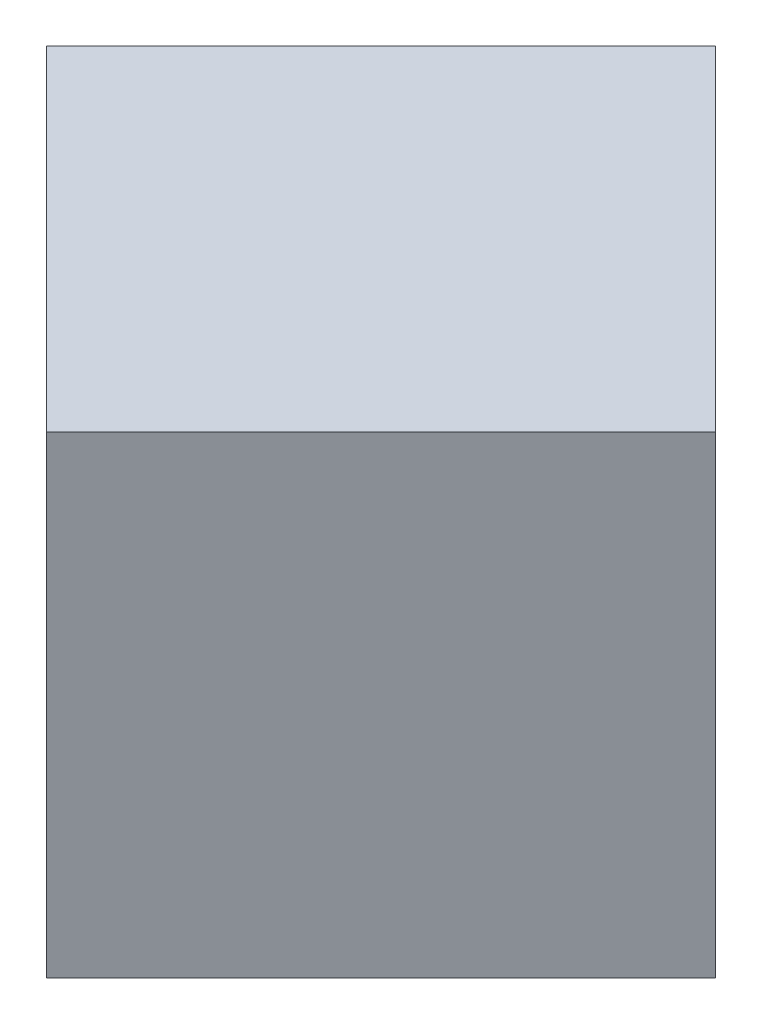
ISO-10303-21;
HEADER;
FILE_DESCRIPTION(('STEP AP214'),'2;1');
FILE_NAME('part.step','',(''),(''),'','','');
FILE_SCHEMA(('AUTOMOTIVE_DESIGN { 1 0 10303 214 1 1 1 1 }'));
ENDSEC;
DATA;
#1=APPLICATION_CONTEXT('core data for automotive mechanical design processes');
#2=APPLICATION_PROTOCOL_DEFINITION('international standard','automotive_design',2000,#1);
#3=PRODUCT_CONTEXT('',#1,'mechanical');
#4=PRODUCT('Part','Part','',(#3));
#5=PRODUCT_RELATED_PRODUCT_CATEGORY('part','',(#4));
#6=PRODUCT_DEFINITION_FORMATION('','',#4);
#7=PRODUCT_DEFINITION_CONTEXT('part definition',#1,'design');
#8=PRODUCT_DEFINITION('design','',#6,#7);
#9=PRODUCT_DEFINITION_SHAPE('','',#8);
#10=(LENGTH_UNIT() NAMED_UNIT(*) SI_UNIT(.MILLI.,.METRE.));
#11=(NAMED_UNIT(*) PLANE_ANGLE_UNIT() SI_UNIT($,.RADIAN.));
#12=(NAMED_UNIT(*) SI_UNIT($,.STERADIAN.) SOLID_ANGLE_UNIT());
#13=UNCERTAINTY_MEASURE_WITH_UNIT(LENGTH_MEASURE(1.E-05),#10,'distance_accuracy_value','');
#14=(GEOMETRIC_REPRESENTATION_CONTEXT(3) GLOBAL_UNCERTAINTY_ASSIGNED_CONTEXT((#13)) GLOBAL_UNIT_ASSIGNED_CONTEXT((#10,
#11,#12)) REPRESENTATION_CONTEXT('',''));
#15=CARTESIAN_POINT('',(0.,0.,0.));
#16=DIRECTION('',(0.,0.,1.));
#17=DIRECTION('',(1.,0.,0.));
#18=AXIS2_PLACEMENT_3D('',#15,#16,#17);
#19=CARTESIAN_POINT('',(1.66533453693773E-13,99.9970649384716,-70.7086045041392));
#20=DIRECTION('',(0.707106781186547,0.,0.707106781186548));
#21=DIRECTION('',(0.707106781186548,0.,-0.707106781186547));
#22=AXIS2_PLACEMENT_3D('',#19,#20,#21);
#23=PLANE('',#22);
#24=DIRECTION('',(-0.707106781186548,0.,0.707106781186547));
#25=VECTOR('',#24,1.);
#26=CARTESIAN_POINT('',(1.66533453693773E-13,0.,-70.7086045041392));
#27=LINE('',#26,#25);
#28=CARTESIAN_POINT('',(1.66533453693773E-13,0.,-70.7086045041392));
#29=VERTEX_POINT('',#28);
#30=CARTESIAN_POINT('',(-70.7086045041392,0.,0.));
#31=VERTEX_POINT('',#30);
#32=EDGE_CURVE('E75',#29,#31,#27,.T.);
#33=ORIENTED_EDGE('',*,*,#32,.T.);
#34=DIRECTION('',(0.,-1.,0.));
#35=VECTOR('',#34,1.);
#36=CARTESIAN_POINT('',(-70.7086045041392,99.9970649384716,0.));
#37=LINE('',#36,#35);
#38=CARTESIAN_POINT('',(-70.7086045041392,99.9970649384716,0.));
#39=VERTEX_POINT('',#38);
#40=EDGE_CURVE('E11',#39,#31,#37,.T.);
#41=ORIENTED_EDGE('',*,*,#40,.F.);
#42=DIRECTION('',(-0.707106781186548,0.,0.707106781186547));
#43=VECTOR('',#42,1.);
#44=CARTESIAN_POINT('',(1.66533453693773E-13,99.9970649384716,-70.7086045041392));
#45=LINE('',#44,#43);
#46=CARTESIAN_POINT('',(1.66533453693773E-13,99.9970649384716,-70.7086045041392));
#47=VERTEX_POINT('',#46);
#48=EDGE_CURVE('E94',#47,#39,#45,.T.);
#49=ORIENTED_EDGE('',*,*,#48,.F.);
#50=DIRECTION('',(0.,-1.,0.));
#51=VECTOR('',#50,1.);
#52=CARTESIAN_POINT('',(1.66533453693773E-13,99.9970649384716,-70.7086045041392));
#53=LINE('',#52,#51);
#54=EDGE_CURVE('E88',#47,#29,#53,.T.);
#55=ORIENTED_EDGE('',*,*,#54,.T.);
#56=EDGE_LOOP('',(#33,#41,#49,#55));
#57=FACE_BOUND('',#56,.T.);
#58=ADVANCED_FACE('F31',(#57),#23,.F.);
#59=CARTESIAN_POINT('',(-70.7086045041392,99.9970649384716,0.));
#60=DIRECTION('',(0.707106781186549,0.,-0.707106781186546));
#61=DIRECTION('',(-0.707106781186546,0.,-0.707106781186549));
#62=AXIS2_PLACEMENT_3D('',#59,#60,#61);
#63=PLANE('',#62);
#64=DIRECTION('',(0.707106781186546,0.,0.707106781186549));
#65=VECTOR('',#64,1.);
#66=CARTESIAN_POINT('',(-70.7086045041392,0.,0.));
#67=LINE('',#66,#65);
#68=CARTESIAN_POINT('',(-2.35922392732846E-13,0.,70.7086045041392));
#69=VERTEX_POINT('',#68);
#70=EDGE_CURVE('E71',#31,#69,#67,.T.);
#71=ORIENTED_EDGE('',*,*,#70,.T.);
#72=DIRECTION('',(0.,-1.,0.));
#73=VECTOR('',#72,1.);
#74=CARTESIAN_POINT('',(-2.35922392732846E-13,99.9970649384716,70.7086045041392));
#75=LINE('',#74,#73);
#76=CARTESIAN_POINT('',(-2.35922392732846E-13,99.9970649384716,70.7086045041392));
#77=VERTEX_POINT('',#76);
#78=EDGE_CURVE('E38',#77,#69,#75,.T.);
#79=ORIENTED_EDGE('',*,*,#78,.F.);
#80=DIRECTION('',(0.707106781186546,0.,0.707106781186549));
#81=VECTOR('',#80,1.);
#82=CARTESIAN_POINT('',(-70.7086045041392,99.9970649384716,0.));
#83=LINE('',#82,#81);
#84=EDGE_CURVE('E84',#39,#77,#83,.T.);
#85=ORIENTED_EDGE('',*,*,#84,.F.);
#86=ORIENTED_EDGE('',*,*,#40,.T.);
#87=EDGE_LOOP('',(#71,#79,#85,#86));
#88=FACE_BOUND('',#87,.T.);
#89=ADVANCED_FACE('F83',(#88),#63,.F.);
#90=CARTESIAN_POINT('',(-2.35922392732846E-13,99.9970649384716,70.7086045041392));
#91=DIRECTION('',(-0.707106781186546,0.,-0.707106781186549));
#92=DIRECTION('',(-0.707106781186549,0.,0.707106781186546));
#93=AXIS2_PLACEMENT_3D('',#90,#91,#92);
#94=PLANE('',#93);
#95=DIRECTION('',(0.707106781186549,0.,-0.707106781186546));
#96=VECTOR('',#95,1.);
#97=CARTESIAN_POINT('',(-2.35922392732846E-13,0.,70.7086045041392));
#98=LINE('',#97,#96);
#99=CARTESIAN_POINT('',(70.7086045041392,0.,0.));
#100=VERTEX_POINT('',#99);
#101=EDGE_CURVE('E76',#69,#100,#98,.T.);
#102=ORIENTED_EDGE('',*,*,#101,.T.);
#103=DIRECTION('',(0.,-1.,0.));
#104=VECTOR('',#103,1.);
#105=CARTESIAN_POINT('',(70.7086045041392,99.9970649384716,0.));
#106=LINE('',#105,#104);
#107=CARTESIAN_POINT('',(70.7086045041392,99.9970649384716,0.));
#108=VERTEX_POINT('',#107);
#109=EDGE_CURVE('E100',#108,#100,#106,.T.);
#110=ORIENTED_EDGE('',*,*,#109,.F.);
#111=DIRECTION('',(0.707106781186549,0.,-0.707106781186546));
#112=VECTOR('',#111,1.);
#113=CARTESIAN_POINT('',(-2.35922392732846E-13,99.9970649384716,70.7086045041392));
#114=LINE('',#113,#112);
#115=EDGE_CURVE('E50',#77,#108,#114,.T.);
#116=ORIENTED_EDGE('',*,*,#115,.F.);
#117=ORIENTED_EDGE('',*,*,#78,.T.);
#118=EDGE_LOOP('',(#102,#110,#116,#117));
#119=FACE_BOUND('',#118,.T.);
#120=ADVANCED_FACE('F103',(#119),#94,.F.);
#121=CARTESIAN_POINT('',(70.7086045041392,99.9970649384716,0.));
#122=DIRECTION('',(-0.707106781186548,0.,0.707106781186547));
#123=DIRECTION('',(0.707106781186547,0.,0.707106781186548));
#124=AXIS2_PLACEMENT_3D('',#121,#122,#123);
#125=PLANE('',#124);
#126=DIRECTION('',(-0.707106781186547,0.,-0.707106781186548));
#127=VECTOR('',#126,1.);
#128=CARTESIAN_POINT('',(70.7086045041392,0.,0.));
#129=LINE('',#128,#127);
#130=EDGE_CURVE('E92',#100,#29,#129,.T.);
#131=ORIENTED_EDGE('',*,*,#130,.T.);
#132=ORIENTED_EDGE('',*,*,#54,.F.);
#133=DIRECTION('',(-0.707106781186547,0.,-0.707106781186548));
#134=VECTOR('',#133,1.);
#135=CARTESIAN_POINT('',(70.7086045041392,99.9970649384716,0.));
#136=LINE('',#135,#134);
#137=EDGE_CURVE('E45',#108,#47,#136,.T.);
#138=ORIENTED_EDGE('',*,*,#137,.F.);
#139=ORIENTED_EDGE('',*,*,#109,.T.);
#140=EDGE_LOOP('',(#131,#132,#138,#139));
#141=FACE_BOUND('',#140,.T.);
#142=ADVANCED_FACE('F105',(#141),#125,.F.);
#143=CARTESIAN_POINT('',(1.66533453693773E-13,99.9970649384716,-70.7086045041392));
#144=DIRECTION('',(0.,-1.,0.));
#145=DIRECTION('',(0.,0.,-1.));
#146=AXIS2_PLACEMENT_3D('',#143,#144,#145);
#147=PLANE('',#146);
#148=ORIENTED_EDGE('',*,*,#48,.T.);
#149=ORIENTED_EDGE('',*,*,#84,.T.);
#150=ORIENTED_EDGE('',*,*,#115,.T.);
#151=ORIENTED_EDGE('',*,*,#137,.T.);
#152=EDGE_LOOP('',(#148,#149,#150,#151));
#153=FACE_BOUND('',#152,.T.);
#154=ADVANCED_FACE('F106',(#153),#147,.F.);
#155=CARTESIAN_POINT('',(1.66533453693773E-13,0.,-70.7086045041392));
#156=DIRECTION('',(0.,-1.,0.));
#157=DIRECTION('',(0.,0.,-1.));
#158=AXIS2_PLACEMENT_3D('',#155,#156,#157);
#159=PLANE('',#158);
#160=ORIENTED_EDGE('',*,*,#32,.F.);
#161=ORIENTED_EDGE('',*,*,#130,.F.);
#162=ORIENTED_EDGE('',*,*,#101,.F.);
#163=ORIENTED_EDGE('',*,*,#70,.F.);
#164=EDGE_LOOP('',(#160,#161,#162,#163));
#165=FACE_BOUND('',#164,.T.);
#166=ADVANCED_FACE('F72',(#165),#159,.T.);
#167=CLOSED_SHELL('',(#58,#89,#120,#142,#154,#166));
#168=MANIFOLD_SOLID_BREP('B2',#167);
#169=ADVANCED_BREP_SHAPE_REPRESENTATION('',(#18,#168),#14);
#170=SHAPE_DEFINITION_REPRESENTATION(#9,#169);
ENDSEC;
END-ISO-10303-21;
